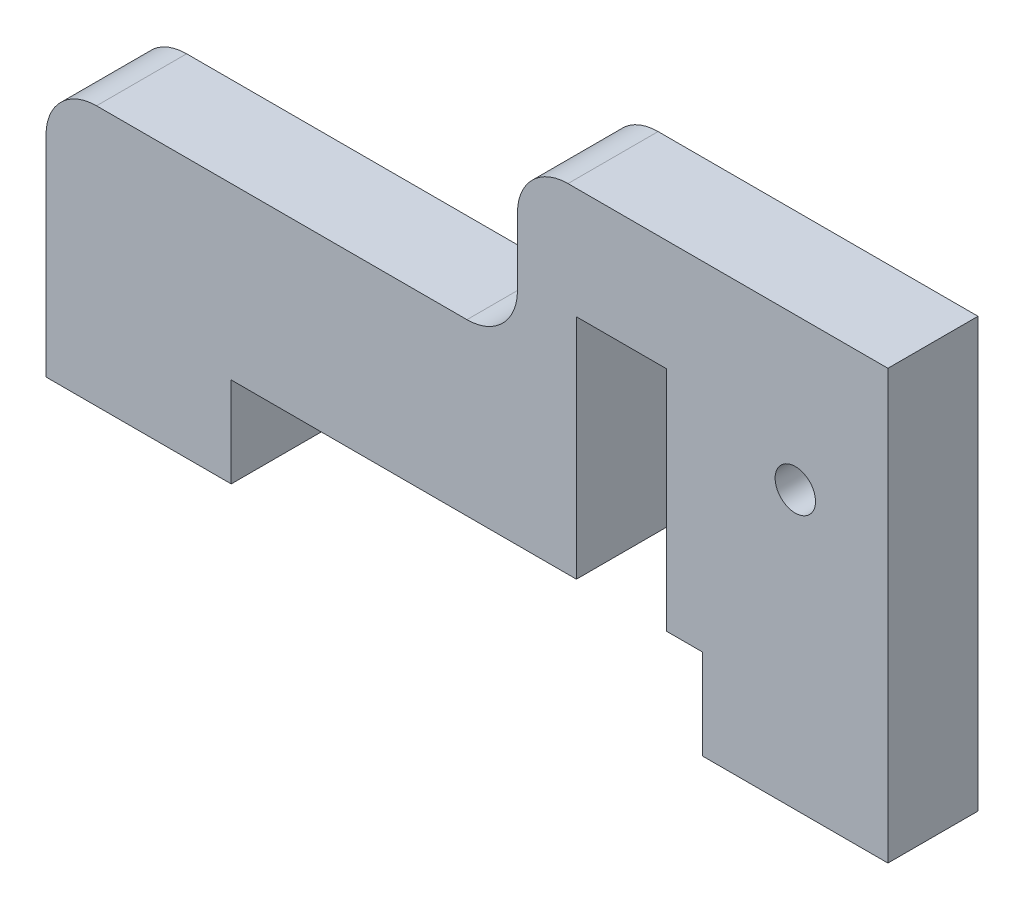
ISO-10303-21;
HEADER;
FILE_DESCRIPTION(('STEP AP214'),'2;1');
FILE_NAME('part.step','',(''),(''),'','','');
FILE_SCHEMA(('AUTOMOTIVE_DESIGN { 1 0 10303 214 1 1 1 1 }'));
ENDSEC;
DATA;
#1=APPLICATION_CONTEXT('core data for automotive mechanical design processes');
#2=APPLICATION_PROTOCOL_DEFINITION('international standard','automotive_design',2000,#1);
#3=PRODUCT_CONTEXT('',#1,'mechanical');
#4=PRODUCT('Part','Part','',(#3));
#5=PRODUCT_RELATED_PRODUCT_CATEGORY('part','',(#4));
#6=PRODUCT_DEFINITION_FORMATION('','',#4);
#7=PRODUCT_DEFINITION_CONTEXT('part definition',#1,'design');
#8=PRODUCT_DEFINITION('design','',#6,#7);
#9=PRODUCT_DEFINITION_SHAPE('','',#8);
#10=(LENGTH_UNIT() NAMED_UNIT(*) SI_UNIT(.MILLI.,.METRE.));
#11=(NAMED_UNIT(*) PLANE_ANGLE_UNIT() SI_UNIT($,.RADIAN.));
#12=(NAMED_UNIT(*) SI_UNIT($,.STERADIAN.) SOLID_ANGLE_UNIT());
#13=UNCERTAINTY_MEASURE_WITH_UNIT(LENGTH_MEASURE(1.E-05),#10,'distance_accuracy_value','');
#14=(GEOMETRIC_REPRESENTATION_CONTEXT(3) GLOBAL_UNCERTAINTY_ASSIGNED_CONTEXT((#13)) GLOBAL_UNIT_ASSIGNED_CONTEXT((#10,
#11,#12)) REPRESENTATION_CONTEXT('',''));
#15=CARTESIAN_POINT('',(0.,0.,0.));
#16=DIRECTION('',(0.,0.,1.));
#17=DIRECTION('',(1.,0.,0.));
#18=AXIS2_PLACEMENT_3D('',#15,#16,#17);
#19=CARTESIAN_POINT('',(3.,12.45,5.35));
#20=DIRECTION('',(0.,0.,1.));
#21=DIRECTION('',(1.,0.,0.));
#22=AXIS2_PLACEMENT_3D('',#19,#20,#21);
#23=PLANE('',#22);
#24=DIRECTION('',(0.,-1.,0.));
#25=VECTOR('',#24,1.);
#26=CARTESIAN_POINT('',(0.,0.,5.35));
#27=LINE('',#26,#25);
#28=CARTESIAN_POINT('',(0.,12.45,5.35));
#29=VERTEX_POINT('',#28);
#30=CARTESIAN_POINT('',(0.,0.,5.35));
#31=VERTEX_POINT('',#30);
#32=EDGE_CURVE('E217',#29,#31,#27,.T.);
#33=ORIENTED_EDGE('',*,*,#32,.T.);
#34=DIRECTION('',(1.,0.,0.));
#35=VECTOR('',#34,1.);
#36=CARTESIAN_POINT('',(0.,0.,5.35));
#37=LINE('',#36,#35);
#38=CARTESIAN_POINT('',(11.,0.,5.35));
#39=VERTEX_POINT('',#38);
#40=EDGE_CURVE('E120',#31,#39,#37,.T.);
#41=ORIENTED_EDGE('',*,*,#40,.T.);
#42=DIRECTION('',(0.,1.,0.));
#43=VECTOR('',#42,1.);
#44=CARTESIAN_POINT('',(11.,0.,5.35));
#45=LINE('',#44,#43);
#46=CARTESIAN_POINT('',(11.,5.35,5.35));
#47=VERTEX_POINT('',#46);
#48=EDGE_CURVE('E259',#39,#47,#45,.T.);
#49=ORIENTED_EDGE('',*,*,#48,.T.);
#50=DIRECTION('',(1.,0.,0.));
#51=VECTOR('',#50,1.);
#52=CARTESIAN_POINT('',(11.,5.35,5.35));
#53=LINE('',#52,#51);
#54=CARTESIAN_POINT('',(31.5,5.35,5.35));
#55=VERTEX_POINT('',#54);
#56=EDGE_CURVE('E278',#47,#55,#53,.T.);
#57=ORIENTED_EDGE('',*,*,#56,.T.);
#58=DIRECTION('',(0.,1.,0.));
#59=VECTOR('',#58,1.);
#60=CARTESIAN_POINT('',(31.5,5.35,5.35));
#61=LINE('',#60,#59);
#62=CARTESIAN_POINT('',(31.5,18.85,5.35));
#63=VERTEX_POINT('',#62);
#64=EDGE_CURVE('E275',#55,#63,#61,.T.);
#65=ORIENTED_EDGE('',*,*,#64,.T.);
#66=DIRECTION('',(1.,0.,0.));
#67=VECTOR('',#66,1.);
#68=CARTESIAN_POINT('',(31.5,18.85,5.35));
#69=LINE('',#68,#67);
#70=CARTESIAN_POINT('',(36.85,18.85,5.35));
#71=VERTEX_POINT('',#70);
#72=EDGE_CURVE('E277',#63,#71,#69,.T.);
#73=ORIENTED_EDGE('',*,*,#72,.T.);
#74=DIRECTION('',(0.,-1.,0.));
#75=VECTOR('',#74,1.);
#76=CARTESIAN_POINT('',(36.85,5.35,5.35));
#77=LINE('',#76,#75);
#78=CARTESIAN_POINT('',(36.85,5.35,5.35));
#79=VERTEX_POINT('',#78);
#80=EDGE_CURVE('E280',#71,#79,#77,.T.);
#81=ORIENTED_EDGE('',*,*,#80,.T.);
#82=DIRECTION('',(1.,0.,0.));
#83=VECTOR('',#82,1.);
#84=CARTESIAN_POINT('',(36.85,5.35,5.35));
#85=LINE('',#84,#83);
#86=CARTESIAN_POINT('',(39.,5.35,5.35));
#87=VERTEX_POINT('',#86);
#88=EDGE_CURVE('E286',#79,#87,#85,.T.);
#89=ORIENTED_EDGE('',*,*,#88,.T.);
#90=DIRECTION('',(0.,-1.,0.));
#91=VECTOR('',#90,1.);
#92=CARTESIAN_POINT('',(39.,0.,5.35));
#93=LINE('',#92,#91);
#94=CARTESIAN_POINT('',(39.,0.,5.35));
#95=VERTEX_POINT('',#94);
#96=EDGE_CURVE('E288',#87,#95,#93,.T.);
#97=ORIENTED_EDGE('',*,*,#96,.T.);
#98=DIRECTION('',(1.,0.,0.));
#99=VECTOR('',#98,1.);
#100=CARTESIAN_POINT('',(39.,0.,5.35));
#101=LINE('',#100,#99);
#102=CARTESIAN_POINT('',(50.,0.,5.35));
#103=VERTEX_POINT('',#102);
#104=EDGE_CURVE('E290',#95,#103,#101,.T.);
#105=ORIENTED_EDGE('',*,*,#104,.T.);
#106=DIRECTION('',(0.,1.,0.));
#107=VECTOR('',#106,1.);
#108=CARTESIAN_POINT('',(50.,0.,5.35));
#109=LINE('',#108,#107);
#110=CARTESIAN_POINT('',(50.,25.45,5.35));
#111=VERTEX_POINT('',#110);
#112=EDGE_CURVE('E292',#103,#111,#109,.T.);
#113=ORIENTED_EDGE('',*,*,#112,.T.);
#114=DIRECTION('',(-1.,0.,0.));
#115=VECTOR('',#114,1.);
#116=CARTESIAN_POINT('',(31.,25.45,5.35));
#117=LINE('',#116,#115);
#118=CARTESIAN_POINT('',(31.,25.45,5.35));
#119=VERTEX_POINT('',#118);
#120=EDGE_CURVE('E294',#111,#119,#117,.T.);
#121=ORIENTED_EDGE('',*,*,#120,.T.);
#122=CARTESIAN_POINT('',(31.,22.45,5.35));
#123=DIRECTION('',(0.,0.,1.));
#124=DIRECTION('',(1.,0.,0.));
#125=AXIS2_PLACEMENT_3D('',#122,#123,#124);
#126=CIRCLE('',#125,3.);
#127=CARTESIAN_POINT('',(28.,22.45,5.35));
#128=VERTEX_POINT('',#127);
#129=EDGE_CURVE('E296',#119,#128,#126,.T.);
#130=ORIENTED_EDGE('',*,*,#129,.T.);
#131=DIRECTION('',(0.,-1.,0.));
#132=VECTOR('',#131,1.);
#133=CARTESIAN_POINT('',(28.,22.45,5.35));
#134=LINE('',#133,#132);
#135=CARTESIAN_POINT('',(28.,18.45,5.35));
#136=VERTEX_POINT('',#135);
#137=EDGE_CURVE('E166',#128,#136,#134,.T.);
#138=ORIENTED_EDGE('',*,*,#137,.T.);
#139=CARTESIAN_POINT('',(25.,18.45,5.35));
#140=DIRECTION('',(0.,0.,-1.));
#141=DIRECTION('',(1.,0.,0.));
#142=AXIS2_PLACEMENT_3D('',#139,#140,#141);
#143=CIRCLE('',#142,3.);
#144=CARTESIAN_POINT('',(25.,15.45,5.35));
#145=VERTEX_POINT('',#144);
#146=EDGE_CURVE('E160',#136,#145,#143,.T.);
#147=ORIENTED_EDGE('',*,*,#146,.T.);
#148=DIRECTION('',(-1.,0.,0.));
#149=VECTOR('',#148,1.);
#150=CARTESIAN_POINT('',(3.,15.45,5.35));
#151=LINE('',#150,#149);
#152=CARTESIAN_POINT('',(3.,15.45,5.35));
#153=VERTEX_POINT('',#152);
#154=EDGE_CURVE('E164',#145,#153,#151,.T.);
#155=ORIENTED_EDGE('',*,*,#154,.T.);
#156=CARTESIAN_POINT('',(3.,12.45,5.35));
#157=DIRECTION('',(0.,0.,1.));
#158=DIRECTION('',(1.,0.,0.));
#159=AXIS2_PLACEMENT_3D('',#156,#157,#158);
#160=CIRCLE('',#159,3.);
#161=EDGE_CURVE('E50',#153,#29,#160,.T.);
#162=ORIENTED_EDGE('',*,*,#161,.T.);
#163=EDGE_LOOP('',(#33,#41,#49,#57,#65,#73,#81,#89,#97,#105,#113,#121,#130,#138,#147,#155,#162));
#164=FACE_BOUND('',#163,.T.);
#165=CARTESIAN_POINT('',(44.5,16.45,5.35));
#166=DIRECTION('',(0.,0.,1.));
#167=DIRECTION('',(1.,0.,0.));
#168=AXIS2_PLACEMENT_3D('',#165,#166,#167);
#169=CIRCLE('',#168,1.2);
#170=CARTESIAN_POINT('',(45.7,16.45,5.35));
#171=VERTEX_POINT('',#170);
#172=EDGE_CURVE('E188',#171,#171,#169,.T.);
#173=ORIENTED_EDGE('',*,*,#172,.F.);
#174=EDGE_LOOP('',(#173));
#175=FACE_BOUND('',#174,.T.);
#176=ADVANCED_FACE('F33',(#164,#175),#23,.T.);
#177=CARTESIAN_POINT('',(3.,12.45,0.));
#178=DIRECTION('',(0.,0.,1.));
#179=DIRECTION('',(1.,0.,0.));
#180=AXIS2_PLACEMENT_3D('',#177,#178,#179);
#181=PLANE('',#180);
#182=DIRECTION('',(0.,-1.,0.));
#183=VECTOR('',#182,1.);
#184=CARTESIAN_POINT('',(0.,0.,0.));
#185=LINE('',#184,#183);
#186=CARTESIAN_POINT('',(0.,12.45,0.));
#187=VERTEX_POINT('',#186);
#188=CARTESIAN_POINT('',(0.,0.,0.));
#189=VERTEX_POINT('',#188);
#190=EDGE_CURVE('E184',#187,#189,#185,.T.);
#191=ORIENTED_EDGE('',*,*,#190,.F.);
#192=CARTESIAN_POINT('',(3.,12.45,0.));
#193=DIRECTION('',(0.,0.,1.));
#194=DIRECTION('',(1.,0.,0.));
#195=AXIS2_PLACEMENT_3D('',#192,#193,#194);
#196=CIRCLE('',#195,3.);
#197=CARTESIAN_POINT('',(3.,15.45,0.));
#198=VERTEX_POINT('',#197);
#199=EDGE_CURVE('E112',#198,#187,#196,.T.);
#200=ORIENTED_EDGE('',*,*,#199,.F.);
#201=DIRECTION('',(-1.,0.,0.));
#202=VECTOR('',#201,1.);
#203=CARTESIAN_POINT('',(3.,15.45,0.));
#204=LINE('',#203,#202);
#205=CARTESIAN_POINT('',(25.,15.45,0.));
#206=VERTEX_POINT('',#205);
#207=EDGE_CURVE('E106',#206,#198,#204,.T.);
#208=ORIENTED_EDGE('',*,*,#207,.F.);
#209=CARTESIAN_POINT('',(25.,18.45,0.));
#210=DIRECTION('',(0.,0.,-1.));
#211=DIRECTION('',(1.,0.,0.));
#212=AXIS2_PLACEMENT_3D('',#209,#210,#211);
#213=CIRCLE('',#212,3.);
#214=CARTESIAN_POINT('',(28.,18.45,0.));
#215=VERTEX_POINT('',#214);
#216=EDGE_CURVE('E174',#215,#206,#213,.T.);
#217=ORIENTED_EDGE('',*,*,#216,.F.);
#218=DIRECTION('',(0.,-1.,0.));
#219=VECTOR('',#218,1.);
#220=CARTESIAN_POINT('',(28.,22.45,0.));
#221=LINE('',#220,#219);
#222=CARTESIAN_POINT('',(28.,22.45,0.));
#223=VERTEX_POINT('',#222);
#224=EDGE_CURVE('E212',#223,#215,#221,.T.);
#225=ORIENTED_EDGE('',*,*,#224,.F.);
#226=CARTESIAN_POINT('',(31.,22.45,0.));
#227=DIRECTION('',(0.,0.,1.));
#228=DIRECTION('',(1.,0.,0.));
#229=AXIS2_PLACEMENT_3D('',#226,#227,#228);
#230=CIRCLE('',#229,3.);
#231=CARTESIAN_POINT('',(31.,25.45,0.));
#232=VERTEX_POINT('',#231);
#233=EDGE_CURVE('E210',#232,#223,#230,.T.);
#234=ORIENTED_EDGE('',*,*,#233,.F.);
#235=DIRECTION('',(-1.,0.,0.));
#236=VECTOR('',#235,1.);
#237=CARTESIAN_POINT('',(31.,25.45,0.));
#238=LINE('',#237,#236);
#239=CARTESIAN_POINT('',(50.,25.45,0.));
#240=VERTEX_POINT('',#239);
#241=EDGE_CURVE('E208',#240,#232,#238,.T.);
#242=ORIENTED_EDGE('',*,*,#241,.F.);
#243=DIRECTION('',(0.,1.,0.));
#244=VECTOR('',#243,1.);
#245=CARTESIAN_POINT('',(50.,0.,0.));
#246=LINE('',#245,#244);
#247=CARTESIAN_POINT('',(50.,0.,0.));
#248=VERTEX_POINT('',#247);
#249=EDGE_CURVE('E206',#248,#240,#246,.T.);
#250=ORIENTED_EDGE('',*,*,#249,.F.);
#251=DIRECTION('',(1.,0.,0.));
#252=VECTOR('',#251,1.);
#253=CARTESIAN_POINT('',(39.,0.,0.));
#254=LINE('',#253,#252);
#255=CARTESIAN_POINT('',(39.,0.,0.));
#256=VERTEX_POINT('',#255);
#257=EDGE_CURVE('E204',#256,#248,#254,.T.);
#258=ORIENTED_EDGE('',*,*,#257,.F.);
#259=DIRECTION('',(0.,-1.,0.));
#260=VECTOR('',#259,1.);
#261=CARTESIAN_POINT('',(39.,0.,0.));
#262=LINE('',#261,#260);
#263=CARTESIAN_POINT('',(39.,5.35,0.));
#264=VERTEX_POINT('',#263);
#265=EDGE_CURVE('E202',#264,#256,#262,.T.);
#266=ORIENTED_EDGE('',*,*,#265,.F.);
#267=DIRECTION('',(1.,0.,0.));
#268=VECTOR('',#267,1.);
#269=CARTESIAN_POINT('',(36.85,5.35,0.));
#270=LINE('',#269,#268);
#271=CARTESIAN_POINT('',(36.85,5.35,0.));
#272=VERTEX_POINT('',#271);
#273=EDGE_CURVE('E200',#272,#264,#270,.T.);
#274=ORIENTED_EDGE('',*,*,#273,.F.);
#275=DIRECTION('',(0.,-1.,0.));
#276=VECTOR('',#275,1.);
#277=CARTESIAN_POINT('',(36.85,5.35,0.));
#278=LINE('',#277,#276);
#279=CARTESIAN_POINT('',(36.85,18.85,0.));
#280=VERTEX_POINT('',#279);
#281=EDGE_CURVE('E198',#280,#272,#278,.T.);
#282=ORIENTED_EDGE('',*,*,#281,.F.);
#283=DIRECTION('',(1.,0.,0.));
#284=VECTOR('',#283,1.);
#285=CARTESIAN_POINT('',(31.5,18.85,0.));
#286=LINE('',#285,#284);
#287=CARTESIAN_POINT('',(31.5,18.85,0.));
#288=VERTEX_POINT('',#287);
#289=EDGE_CURVE('E196',#288,#280,#286,.T.);
#290=ORIENTED_EDGE('',*,*,#289,.F.);
#291=DIRECTION('',(0.,1.,0.));
#292=VECTOR('',#291,1.);
#293=CARTESIAN_POINT('',(31.5,5.35,0.));
#294=LINE('',#293,#292);
#295=CARTESIAN_POINT('',(31.5,5.35,0.));
#296=VERTEX_POINT('',#295);
#297=EDGE_CURVE('E194',#296,#288,#294,.T.);
#298=ORIENTED_EDGE('',*,*,#297,.F.);
#299=DIRECTION('',(1.,0.,0.));
#300=VECTOR('',#299,1.);
#301=CARTESIAN_POINT('',(11.,5.35,0.));
#302=LINE('',#301,#300);
#303=CARTESIAN_POINT('',(11.,5.35,0.));
#304=VERTEX_POINT('',#303);
#305=EDGE_CURVE('E192',#304,#296,#302,.T.);
#306=ORIENTED_EDGE('',*,*,#305,.F.);
#307=DIRECTION('',(0.,1.,0.));
#308=VECTOR('',#307,1.);
#309=CARTESIAN_POINT('',(11.,0.,0.));
#310=LINE('',#309,#308);
#311=CARTESIAN_POINT('',(11.,0.,0.));
#312=VERTEX_POINT('',#311);
#313=EDGE_CURVE('E190',#312,#304,#310,.T.);
#314=ORIENTED_EDGE('',*,*,#313,.F.);
#315=DIRECTION('',(1.,0.,0.));
#316=VECTOR('',#315,1.);
#317=CARTESIAN_POINT('',(0.,0.,0.));
#318=LINE('',#317,#316);
#319=EDGE_CURVE('E187',#189,#312,#318,.T.);
#320=ORIENTED_EDGE('',*,*,#319,.F.);
#321=EDGE_LOOP('',(#191,#200,#208,#217,#225,#234,#242,#250,#258,#266,#274,#282,#290,#298,#306,
#314,#320));
#322=FACE_BOUND('',#321,.T.);
#323=CARTESIAN_POINT('',(44.5,16.45,0.));
#324=DIRECTION('',(0.,0.,1.));
#325=DIRECTION('',(1.,0.,0.));
#326=AXIS2_PLACEMENT_3D('',#323,#324,#325);
#327=CIRCLE('',#326,1.2);
#328=CARTESIAN_POINT('',(45.7,16.45,0.));
#329=VERTEX_POINT('',#328);
#330=EDGE_CURVE('E514',#329,#329,#327,.T.);
#331=ORIENTED_EDGE('',*,*,#330,.T.);
#332=EDGE_LOOP('',(#331));
#333=FACE_BOUND('',#332,.T.);
#334=ADVANCED_FACE('F263',(#322,#333),#181,.F.);
#335=CARTESIAN_POINT('',(0.,0.,5.35));
#336=DIRECTION('',(1.,0.,0.));
#337=DIRECTION('',(0.,0.,-1.));
#338=AXIS2_PLACEMENT_3D('',#335,#336,#337);
#339=PLANE('',#338);
#340=ORIENTED_EDGE('',*,*,#190,.T.);
#341=DIRECTION('',(0.,0.,-1.));
#342=VECTOR('',#341,1.);
#343=CARTESIAN_POINT('',(0.,0.,5.35));
#344=LINE('',#343,#342);
#345=EDGE_CURVE('E11',#31,#189,#344,.T.);
#346=ORIENTED_EDGE('',*,*,#345,.F.);
#347=ORIENTED_EDGE('',*,*,#32,.F.);
#348=DIRECTION('',(0.,0.,-1.));
#349=VECTOR('',#348,1.);
#350=CARTESIAN_POINT('',(0.,12.45,5.35));
#351=LINE('',#350,#349);
#352=EDGE_CURVE('E180',#29,#187,#351,.T.);
#353=ORIENTED_EDGE('',*,*,#352,.T.);
#354=EDGE_LOOP('',(#340,#346,#347,#353));
#355=FACE_BOUND('',#354,.T.);
#356=ADVANCED_FACE('F35',(#355),#339,.F.);
#357=CARTESIAN_POINT('',(0.,0.,5.35));
#358=DIRECTION('',(0.,1.,0.));
#359=DIRECTION('',(0.,0.,1.));
#360=AXIS2_PLACEMENT_3D('',#357,#358,#359);
#361=PLANE('',#360);
#362=ORIENTED_EDGE('',*,*,#319,.T.);
#363=DIRECTION('',(0.,0.,-1.));
#364=VECTOR('',#363,1.);
#365=CARTESIAN_POINT('',(11.,0.,5.35));
#366=LINE('',#365,#364);
#367=EDGE_CURVE('E42',#39,#312,#366,.T.);
#368=ORIENTED_EDGE('',*,*,#367,.F.);
#369=ORIENTED_EDGE('',*,*,#40,.F.);
#370=ORIENTED_EDGE('',*,*,#345,.T.);
#371=EDGE_LOOP('',(#362,#368,#369,#370));
#372=FACE_BOUND('',#371,.T.);
#373=ADVANCED_FACE('F330',(#372),#361,.F.);
#374=CARTESIAN_POINT('',(11.,0.,5.35));
#375=DIRECTION('',(-1.,0.,0.));
#376=DIRECTION('',(0.,0.,1.));
#377=AXIS2_PLACEMENT_3D('',#374,#375,#376);
#378=PLANE('',#377);
#379=ORIENTED_EDGE('',*,*,#313,.T.);
#380=DIRECTION('',(0.,0.,-1.));
#381=VECTOR('',#380,1.);
#382=CARTESIAN_POINT('',(11.,5.35,5.35));
#383=LINE('',#382,#381);
#384=EDGE_CURVE('E251',#47,#304,#383,.T.);
#385=ORIENTED_EDGE('',*,*,#384,.F.);
#386=ORIENTED_EDGE('',*,*,#48,.F.);
#387=ORIENTED_EDGE('',*,*,#367,.T.);
#388=EDGE_LOOP('',(#379,#385,#386,#387));
#389=FACE_BOUND('',#388,.T.);
#390=ADVANCED_FACE('F257',(#389),#378,.F.);
#391=CARTESIAN_POINT('',(11.,5.35,5.35));
#392=DIRECTION('',(0.,1.,0.));
#393=DIRECTION('',(0.,0.,1.));
#394=AXIS2_PLACEMENT_3D('',#391,#392,#393);
#395=PLANE('',#394);
#396=ORIENTED_EDGE('',*,*,#305,.T.);
#397=DIRECTION('',(0.,0.,-1.));
#398=VECTOR('',#397,1.);
#399=CARTESIAN_POINT('',(31.5,5.35,5.35));
#400=LINE('',#399,#398);
#401=EDGE_CURVE('E248',#55,#296,#400,.T.);
#402=ORIENTED_EDGE('',*,*,#401,.F.);
#403=ORIENTED_EDGE('',*,*,#56,.F.);
#404=ORIENTED_EDGE('',*,*,#384,.T.);
#405=EDGE_LOOP('',(#396,#402,#403,#404));
#406=FACE_BOUND('',#405,.T.);
#407=ADVANCED_FACE('F269',(#406),#395,.F.);
#408=CARTESIAN_POINT('',(31.5,5.35,5.35));
#409=DIRECTION('',(-1.,0.,0.));
#410=DIRECTION('',(0.,0.,1.));
#411=AXIS2_PLACEMENT_3D('',#408,#409,#410);
#412=PLANE('',#411);
#413=ORIENTED_EDGE('',*,*,#297,.T.);
#414=DIRECTION('',(0.,0.,-1.));
#415=VECTOR('',#414,1.);
#416=CARTESIAN_POINT('',(31.5,18.85,5.35));
#417=LINE('',#416,#415);
#418=EDGE_CURVE('E245',#63,#288,#417,.T.);
#419=ORIENTED_EDGE('',*,*,#418,.F.);
#420=ORIENTED_EDGE('',*,*,#64,.F.);
#421=ORIENTED_EDGE('',*,*,#401,.T.);
#422=EDGE_LOOP('',(#413,#419,#420,#421));
#423=FACE_BOUND('',#422,.T.);
#424=ADVANCED_FACE('F273',(#423),#412,.F.);
#425=CARTESIAN_POINT('',(31.5,18.85,5.35));
#426=DIRECTION('',(0.,1.,0.));
#427=DIRECTION('',(0.,0.,1.));
#428=AXIS2_PLACEMENT_3D('',#425,#426,#427);
#429=PLANE('',#428);
#430=ORIENTED_EDGE('',*,*,#289,.T.);
#431=DIRECTION('',(0.,0.,-1.));
#432=VECTOR('',#431,1.);
#433=CARTESIAN_POINT('',(36.85,18.85,5.35));
#434=LINE('',#433,#432);
#435=EDGE_CURVE('E242',#71,#280,#434,.T.);
#436=ORIENTED_EDGE('',*,*,#435,.F.);
#437=ORIENTED_EDGE('',*,*,#72,.F.);
#438=ORIENTED_EDGE('',*,*,#418,.T.);
#439=EDGE_LOOP('',(#430,#436,#437,#438));
#440=FACE_BOUND('',#439,.T.);
#441=ADVANCED_FACE('F343',(#440),#429,.F.);
#442=CARTESIAN_POINT('',(36.85,5.35,5.35));
#443=DIRECTION('',(1.,0.,0.));
#444=DIRECTION('',(0.,1.,0.));
#445=AXIS2_PLACEMENT_3D('',#442,#443,#444);
#446=PLANE('',#445);
#447=ORIENTED_EDGE('',*,*,#281,.T.);
#448=DIRECTION('',(0.,0.,-1.));
#449=VECTOR('',#448,1.);
#450=CARTESIAN_POINT('',(36.85,5.35,5.35));
#451=LINE('',#450,#449);
#452=EDGE_CURVE('E239',#79,#272,#451,.T.);
#453=ORIENTED_EDGE('',*,*,#452,.F.);
#454=ORIENTED_EDGE('',*,*,#80,.F.);
#455=ORIENTED_EDGE('',*,*,#435,.T.);
#456=EDGE_LOOP('',(#447,#453,#454,#455));
#457=FACE_BOUND('',#456,.T.);
#458=ADVANCED_FACE('F346',(#457),#446,.F.);
#459=CARTESIAN_POINT('',(36.85,5.35,5.35));
#460=DIRECTION('',(0.,1.,0.));
#461=DIRECTION('',(0.,0.,1.));
#462=AXIS2_PLACEMENT_3D('',#459,#460,#461);
#463=PLANE('',#462);
#464=ORIENTED_EDGE('',*,*,#273,.T.);
#465=DIRECTION('',(0.,0.,-1.));
#466=VECTOR('',#465,1.);
#467=CARTESIAN_POINT('',(39.,5.35,5.35));
#468=LINE('',#467,#466);
#469=EDGE_CURVE('E236',#87,#264,#468,.T.);
#470=ORIENTED_EDGE('',*,*,#469,.F.);
#471=ORIENTED_EDGE('',*,*,#88,.F.);
#472=ORIENTED_EDGE('',*,*,#452,.T.);
#473=EDGE_LOOP('',(#464,#470,#471,#472));
#474=FACE_BOUND('',#473,.T.);
#475=ADVANCED_FACE('F350',(#474),#463,.F.);
#476=CARTESIAN_POINT('',(39.,0.,5.35));
#477=DIRECTION('',(1.,0.,0.));
#478=DIRECTION('',(0.,0.,-1.));
#479=AXIS2_PLACEMENT_3D('',#476,#477,#478);
#480=PLANE('',#479);
#481=ORIENTED_EDGE('',*,*,#265,.T.);
#482=DIRECTION('',(0.,0.,-1.));
#483=VECTOR('',#482,1.);
#484=CARTESIAN_POINT('',(39.,0.,5.35));
#485=LINE('',#484,#483);
#486=EDGE_CURVE('E233',#95,#256,#485,.T.);
#487=ORIENTED_EDGE('',*,*,#486,.F.);
#488=ORIENTED_EDGE('',*,*,#96,.F.);
#489=ORIENTED_EDGE('',*,*,#469,.T.);
#490=EDGE_LOOP('',(#481,#487,#488,#489));
#491=FACE_BOUND('',#490,.T.);
#492=ADVANCED_FACE('F354',(#491),#480,.F.);
#493=CARTESIAN_POINT('',(39.,0.,5.35));
#494=DIRECTION('',(0.,1.,0.));
#495=DIRECTION('',(0.,0.,1.));
#496=AXIS2_PLACEMENT_3D('',#493,#494,#495);
#497=PLANE('',#496);
#498=ORIENTED_EDGE('',*,*,#257,.T.);
#499=DIRECTION('',(0.,0.,-1.));
#500=VECTOR('',#499,1.);
#501=CARTESIAN_POINT('',(50.,0.,5.35));
#502=LINE('',#501,#500);
#503=EDGE_CURVE('E230',#103,#248,#502,.T.);
#504=ORIENTED_EDGE('',*,*,#503,.F.);
#505=ORIENTED_EDGE('',*,*,#104,.F.);
#506=ORIENTED_EDGE('',*,*,#486,.T.);
#507=EDGE_LOOP('',(#498,#504,#505,#506));
#508=FACE_BOUND('',#507,.T.);
#509=ADVANCED_FACE('F358',(#508),#497,.F.);
#510=CARTESIAN_POINT('',(50.,0.,5.35));
#511=DIRECTION('',(-1.,0.,0.));
#512=DIRECTION('',(0.,0.,1.));
#513=AXIS2_PLACEMENT_3D('',#510,#511,#512);
#514=PLANE('',#513);
#515=ORIENTED_EDGE('',*,*,#249,.T.);
#516=DIRECTION('',(0.,0.,-1.));
#517=VECTOR('',#516,1.);
#518=CARTESIAN_POINT('',(50.,25.45,5.35));
#519=LINE('',#518,#517);
#520=EDGE_CURVE('E227',#111,#240,#519,.T.);
#521=ORIENTED_EDGE('',*,*,#520,.F.);
#522=ORIENTED_EDGE('',*,*,#112,.F.);
#523=ORIENTED_EDGE('',*,*,#503,.T.);
#524=EDGE_LOOP('',(#515,#521,#522,#523));
#525=FACE_BOUND('',#524,.T.);
#526=ADVANCED_FACE('F362',(#525),#514,.F.);
#527=CARTESIAN_POINT('',(31.,25.45,5.35));
#528=DIRECTION('',(0.,-1.,0.));
#529=DIRECTION('',(1.,0.,0.));
#530=AXIS2_PLACEMENT_3D('',#527,#528,#529);
#531=PLANE('',#530);
#532=ORIENTED_EDGE('',*,*,#241,.T.);
#533=DIRECTION('',(0.,0.,-1.));
#534=VECTOR('',#533,1.);
#535=CARTESIAN_POINT('',(31.,25.45,5.35));
#536=LINE('',#535,#534);
#537=EDGE_CURVE('E224',#119,#232,#536,.T.);
#538=ORIENTED_EDGE('',*,*,#537,.F.);
#539=ORIENTED_EDGE('',*,*,#120,.F.);
#540=ORIENTED_EDGE('',*,*,#520,.T.);
#541=EDGE_LOOP('',(#532,#538,#539,#540));
#542=FACE_BOUND('',#541,.T.);
#543=ADVANCED_FACE('F366',(#542),#531,.F.);
#544=CARTESIAN_POINT('',(31.,22.45,5.35));
#545=DIRECTION('',(0.,0.,-1.));
#546=DIRECTION('',(-1.,0.,0.));
#547=AXIS2_PLACEMENT_3D('',#544,#545,#546);
#548=CYLINDRICAL_SURFACE('',#547,3.);
#549=ORIENTED_EDGE('',*,*,#233,.T.);
#550=DIRECTION('',(0.,0.,-1.));
#551=VECTOR('',#550,1.);
#552=CARTESIAN_POINT('',(28.,22.45,5.35));
#553=LINE('',#552,#551);
#554=EDGE_CURVE('E221',#128,#223,#553,.T.);
#555=ORIENTED_EDGE('',*,*,#554,.F.);
#556=ORIENTED_EDGE('',*,*,#129,.F.);
#557=ORIENTED_EDGE('',*,*,#537,.T.);
#558=EDGE_LOOP('',(#549,#555,#556,#557));
#559=FACE_BOUND('',#558,.T.);
#560=ADVANCED_FACE('F302',(#559),#548,.T.);
#561=CARTESIAN_POINT('',(28.,22.45,5.35));
#562=DIRECTION('',(1.,0.,0.));
#563=DIRECTION('',(0.,1.,0.));
#564=AXIS2_PLACEMENT_3D('',#561,#562,#563);
#565=PLANE('',#564);
#566=ORIENTED_EDGE('',*,*,#224,.T.);
#567=DIRECTION('',(0.,0.,-1.));
#568=VECTOR('',#567,1.);
#569=CARTESIAN_POINT('',(28.,18.45,5.35));
#570=LINE('',#569,#568);
#571=EDGE_CURVE('E175',#136,#215,#570,.T.);
#572=ORIENTED_EDGE('',*,*,#571,.F.);
#573=ORIENTED_EDGE('',*,*,#137,.F.);
#574=ORIENTED_EDGE('',*,*,#554,.T.);
#575=EDGE_LOOP('',(#566,#572,#573,#574));
#576=FACE_BOUND('',#575,.T.);
#577=ADVANCED_FACE('F306',(#576),#565,.F.);
#578=CARTESIAN_POINT('',(25.,18.45,5.35));
#579=DIRECTION('',(0.,0.,-1.));
#580=DIRECTION('',(-1.,0.,0.));
#581=AXIS2_PLACEMENT_3D('',#578,#579,#580);
#582=CYLINDRICAL_SURFACE('',#581,3.);
#583=ORIENTED_EDGE('',*,*,#216,.T.);
#584=DIRECTION('',(0.,0.,-1.));
#585=VECTOR('',#584,1.);
#586=CARTESIAN_POINT('',(25.,15.45,5.35));
#587=LINE('',#586,#585);
#588=EDGE_CURVE('E171',#145,#206,#587,.T.);
#589=ORIENTED_EDGE('',*,*,#588,.F.);
#590=ORIENTED_EDGE('',*,*,#146,.F.);
#591=ORIENTED_EDGE('',*,*,#571,.T.);
#592=EDGE_LOOP('',(#583,#589,#590,#591));
#593=FACE_BOUND('',#592,.T.);
#594=ADVANCED_FACE('F172',(#593),#582,.F.);
#595=CARTESIAN_POINT('',(3.,15.45,5.35));
#596=DIRECTION('',(0.,-1.,0.));
#597=DIRECTION('',(1.,0.,0.));
#598=AXIS2_PLACEMENT_3D('',#595,#596,#597);
#599=PLANE('',#598);
#600=ORIENTED_EDGE('',*,*,#207,.T.);
#601=DIRECTION('',(0.,0.,-1.));
#602=VECTOR('',#601,1.);
#603=CARTESIAN_POINT('',(3.,15.45,5.35));
#604=LINE('',#603,#602);
#605=EDGE_CURVE('E176',#153,#198,#604,.T.);
#606=ORIENTED_EDGE('',*,*,#605,.F.);
#607=ORIENTED_EDGE('',*,*,#154,.F.);
#608=ORIENTED_EDGE('',*,*,#588,.T.);
#609=EDGE_LOOP('',(#600,#606,#607,#608));
#610=FACE_BOUND('',#609,.T.);
#611=ADVANCED_FACE('F178',(#610),#599,.F.);
#612=CARTESIAN_POINT('',(3.,12.45,5.35));
#613=DIRECTION('',(0.,0.,-1.));
#614=DIRECTION('',(-1.,0.,0.));
#615=AXIS2_PLACEMENT_3D('',#612,#613,#614);
#616=CYLINDRICAL_SURFACE('',#615,3.);
#617=ORIENTED_EDGE('',*,*,#199,.T.);
#618=ORIENTED_EDGE('',*,*,#352,.F.);
#619=ORIENTED_EDGE('',*,*,#161,.F.);
#620=ORIENTED_EDGE('',*,*,#605,.T.);
#621=EDGE_LOOP('',(#617,#618,#619,#620));
#622=FACE_BOUND('',#621,.T.);
#623=ADVANCED_FACE('F310',(#622),#616,.T.);
#624=CARTESIAN_POINT('',(44.5,16.45,5.35));
#625=DIRECTION('',(0.,0.,-1.));
#626=DIRECTION('',(-1.,0.,0.));
#627=AXIS2_PLACEMENT_3D('',#624,#625,#626);
#628=CYLINDRICAL_SURFACE('',#627,1.2);
#629=ORIENTED_EDGE('',*,*,#172,.T.);
#630=EDGE_LOOP('',(#629));
#631=FACE_BOUND('',#630,.T.);
#632=ORIENTED_EDGE('',*,*,#330,.F.);
#633=EDGE_LOOP('',(#632));
#634=FACE_BOUND('',#633,.T.);
#635=ADVANCED_FACE('F312',(#631,#634),#628,.F.);
#636=CLOSED_SHELL('',(#176,#334,#356,#373,#390,#407,#424,#441,#458,#475,#492,#509,#526,#543,
#560,#577,#594,#611,#623,#635));
#637=MANIFOLD_SOLID_BREP('B2',#636);
#638=ADVANCED_BREP_SHAPE_REPRESENTATION('',(#18,#637),#14);
#639=SHAPE_DEFINITION_REPRESENTATION(#9,#638);
ENDSEC;
END-ISO-10303-21;
